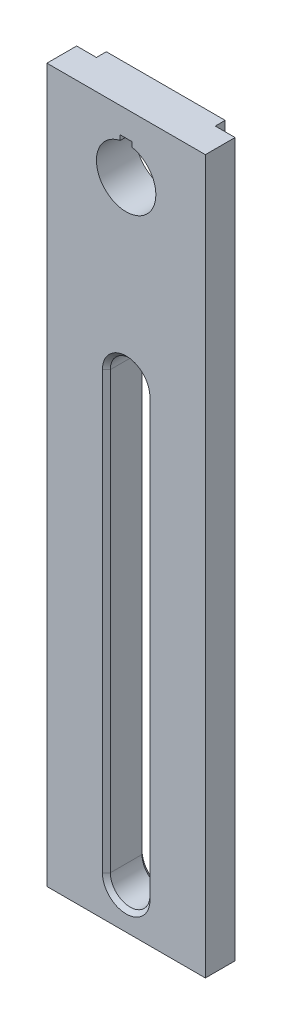
ISO-10303-21;
HEADER;
FILE_DESCRIPTION(('STEP AP214'),'2;1');
FILE_NAME('part.step','',(''),(''),'','','');
FILE_SCHEMA(('AUTOMOTIVE_DESIGN { 1 0 10303 214 1 1 1 1 }'));
ENDSEC;
DATA;
#1=APPLICATION_CONTEXT('core data for automotive mechanical design processes');
#2=APPLICATION_PROTOCOL_DEFINITION('international standard','automotive_design',2000,#1);
#3=PRODUCT_CONTEXT('',#1,'mechanical');
#4=PRODUCT('Part','Part','',(#3));
#5=PRODUCT_RELATED_PRODUCT_CATEGORY('part','',(#4));
#6=PRODUCT_DEFINITION_FORMATION('','',#4);
#7=PRODUCT_DEFINITION_CONTEXT('part definition',#1,'design');
#8=PRODUCT_DEFINITION('design','',#6,#7);
#9=PRODUCT_DEFINITION_SHAPE('','',#8);
#10=(LENGTH_UNIT() NAMED_UNIT(*) SI_UNIT(.MILLI.,.METRE.));
#11=(NAMED_UNIT(*) PLANE_ANGLE_UNIT() SI_UNIT($,.RADIAN.));
#12=(NAMED_UNIT(*) SI_UNIT($,.STERADIAN.) SOLID_ANGLE_UNIT());
#13=UNCERTAINTY_MEASURE_WITH_UNIT(LENGTH_MEASURE(1.E-05),#10,'distance_accuracy_value','');
#14=(GEOMETRIC_REPRESENTATION_CONTEXT(3) GLOBAL_UNCERTAINTY_ASSIGNED_CONTEXT((#13)) GLOBAL_UNIT_ASSIGNED_CONTEXT((#10,
#11,#12)) REPRESENTATION_CONTEXT('',''));
#15=CARTESIAN_POINT('',(0.,0.,0.));
#16=DIRECTION('',(0.,0.,1.));
#17=DIRECTION('',(1.,0.,0.));
#18=AXIS2_PLACEMENT_3D('',#15,#16,#17);
#19=CARTESIAN_POINT('',(0.,0.,10.));
#20=DIRECTION('',(0.,0.,1.));
#21=DIRECTION('',(1.,0.,0.));
#22=AXIS2_PLACEMENT_3D('',#19,#20,#21);
#23=PLANE('',#22);
#24=DIRECTION('',(0.,1.,0.));
#25=VECTOR('',#24,1.);
#26=CARTESIAN_POINT('',(-6.00000000000001,0.,10.));
#27=LINE('',#26,#25);
#28=CARTESIAN_POINT('',(-6.,30.,10.));
#29=VERTEX_POINT('',#28);
#30=CARTESIAN_POINT('',(-5.99999999999999,140.,10.));
#31=VERTEX_POINT('',#30);
#32=EDGE_CURVE('E235',#29,#31,#27,.T.);
#33=ORIENTED_EDGE('',*,*,#32,.T.);
#34=CARTESIAN_POINT('',(0.,140.,10.));
#35=DIRECTION('',(0.,0.,1.));
#36=DIRECTION('',(1.,0.,0.));
#37=AXIS2_PLACEMENT_3D('',#34,#35,#36);
#38=CIRCLE('',#37,5.99999999999997);
#39=CARTESIAN_POINT('',(5.99999999999995,140.,10.));
#40=VERTEX_POINT('',#39);
#41=EDGE_CURVE('E11',#31,#40,#38,.F.);
#42=ORIENTED_EDGE('',*,*,#41,.T.);
#43=DIRECTION('',(0.,-1.,0.));
#44=VECTOR('',#43,1.);
#45=CARTESIAN_POINT('',(6.,0.,10.));
#46=LINE('',#45,#44);
#47=CARTESIAN_POINT('',(5.99999999999999,30.,10.));
#48=VERTEX_POINT('',#47);
#49=EDGE_CURVE('E47',#40,#48,#46,.T.);
#50=ORIENTED_EDGE('',*,*,#49,.T.);
#51=CARTESIAN_POINT('',(0.,30.,10.));
#52=DIRECTION('',(0.,0.,1.));
#53=DIRECTION('',(1.,0.,0.));
#54=AXIS2_PLACEMENT_3D('',#51,#52,#53);
#55=CIRCLE('',#54,6.);
#56=EDGE_CURVE('E237',#48,#29,#55,.F.);
#57=ORIENTED_EDGE('',*,*,#56,.T.);
#58=EDGE_LOOP('',(#33,#42,#50,#57));
#59=FACE_BOUND('',#58,.T.);
#60=CARTESIAN_POINT('',(0.,185.,10.));
#61=DIRECTION('',(0.,0.,1.));
#62=DIRECTION('',(1.,0.,0.));
#63=AXIS2_PLACEMENT_3D('',#60,#61,#62);
#64=CIRCLE('',#63,7.5);
#65=CARTESIAN_POINT('',(-1.49351545528312,192.349789900727,10.));
#66=VERTEX_POINT('',#65);
#67=CARTESIAN_POINT('',(1.49351545528312,192.349789900727,10.));
#68=VERTEX_POINT('',#67);
#69=EDGE_CURVE('E295',#66,#68,#64,.T.);
#70=ORIENTED_EDGE('',*,*,#69,.F.);
#71=DIRECTION('',(0.,-1.,0.));
#72=VECTOR('',#71,1.);
#73=CARTESIAN_POINT('',(-1.49351545528312,193.580554332855,10.));
#74=LINE('',#73,#72);
#75=CARTESIAN_POINT('',(-1.49351545528312,193.580554332855,10.));
#76=VERTEX_POINT('',#75);
#77=EDGE_CURVE('E293',#76,#66,#74,.T.);
#78=ORIENTED_EDGE('',*,*,#77,.F.);
#79=DIRECTION('',(-1.,0.,0.));
#80=VECTOR('',#79,1.);
#81=CARTESIAN_POINT('',(1.49351545528312,193.580554332855,10.));
#82=LINE('',#81,#80);
#83=CARTESIAN_POINT('',(1.49351545528312,193.580554332855,10.));
#84=VERTEX_POINT('',#83);
#85=EDGE_CURVE('E301',#84,#76,#82,.T.);
#86=ORIENTED_EDGE('',*,*,#85,.F.);
#87=DIRECTION('',(0.,1.,0.));
#88=VECTOR('',#87,1.);
#89=CARTESIAN_POINT('',(1.49351545528312,193.580554332855,10.));
#90=LINE('',#89,#88);
#91=EDGE_CURVE('E298',#68,#84,#90,.T.);
#92=ORIENTED_EDGE('',*,*,#91,.F.);
#93=EDGE_LOOP('',(#70,#78,#86,#92));
#94=FACE_BOUND('',#93,.T.);
#95=DIRECTION('',(1.,0.,0.));
#96=VECTOR('',#95,1.);
#97=CARTESIAN_POINT('',(20.,20.,10.));
#98=LINE('',#97,#96);
#99=CARTESIAN_POINT('',(-19.9999999999999,20.,10.));
#100=VERTEX_POINT('',#99);
#101=CARTESIAN_POINT('',(20.,20.,10.));
#102=VERTEX_POINT('',#101);
#103=EDGE_CURVE('E321',#100,#102,#98,.T.);
#104=ORIENTED_EDGE('',*,*,#103,.T.);
#105=DIRECTION('',(0.,1.,0.));
#106=VECTOR('',#105,1.);
#107=CARTESIAN_POINT('',(20.,200.,10.));
#108=LINE('',#107,#106);
#109=CARTESIAN_POINT('',(20.,200.,10.));
#110=VERTEX_POINT('',#109);
#111=EDGE_CURVE('E200',#102,#110,#108,.T.);
#112=ORIENTED_EDGE('',*,*,#111,.T.);
#113=DIRECTION('',(-1.,0.,0.));
#114=VECTOR('',#113,1.);
#115=CARTESIAN_POINT('',(20.,200.,10.));
#116=LINE('',#115,#114);
#117=CARTESIAN_POINT('',(-20.,200.,10.));
#118=VERTEX_POINT('',#117);
#119=EDGE_CURVE('E325',#110,#118,#116,.T.);
#120=ORIENTED_EDGE('',*,*,#119,.T.);
#121=DIRECTION('',(0.,-1.,0.));
#122=VECTOR('',#121,1.);
#123=CARTESIAN_POINT('',(-20.,200.,10.));
#124=LINE('',#123,#122);
#125=EDGE_CURVE('E327',#118,#100,#124,.T.);
#126=ORIENTED_EDGE('',*,*,#125,.T.);
#127=EDGE_LOOP('',(#104,#112,#120,#126));
#128=FACE_BOUND('',#127,.T.);
#129=ADVANCED_FACE('F38',(#59,#94,#128),#23,.T.);
#130=CARTESIAN_POINT('',(0.,0.,0.));
#131=DIRECTION('',(0.,0.,1.));
#132=DIRECTION('',(1.,0.,0.));
#133=AXIS2_PLACEMENT_3D('',#130,#131,#132);
#134=PLANE('',#133);
#135=DIRECTION('',(0.,1.,0.));
#136=VECTOR('',#135,1.);
#137=CARTESIAN_POINT('',(5.99999999999996,140.,0.));
#138=LINE('',#137,#136);
#139=CARTESIAN_POINT('',(6.,30.,0.));
#140=VERTEX_POINT('',#139);
#141=CARTESIAN_POINT('',(5.99999999999996,140.,0.));
#142=VERTEX_POINT('',#141);
#143=EDGE_CURVE('E205',#140,#142,#138,.T.);
#144=ORIENTED_EDGE('',*,*,#143,.T.);
#145=CARTESIAN_POINT('',(0.,140.,0.));
#146=DIRECTION('',(0.,0.,1.));
#147=DIRECTION('',(1.,0.,0.));
#148=AXIS2_PLACEMENT_3D('',#145,#146,#147);
#149=CIRCLE('',#148,5.99999999999998);
#150=CARTESIAN_POINT('',(-6.,140.,0.));
#151=VERTEX_POINT('',#150);
#152=EDGE_CURVE('E214',#142,#151,#149,.T.);
#153=ORIENTED_EDGE('',*,*,#152,.T.);
#154=DIRECTION('',(0.,-1.,0.));
#155=VECTOR('',#154,1.);
#156=CARTESIAN_POINT('',(-6.00000000000001,30.,0.));
#157=LINE('',#156,#155);
#158=CARTESIAN_POINT('',(-6.00000000000001,30.,0.));
#159=VERTEX_POINT('',#158);
#160=EDGE_CURVE('E212',#151,#159,#157,.T.);
#161=ORIENTED_EDGE('',*,*,#160,.T.);
#162=CARTESIAN_POINT('',(0.,30.,0.));
#163=DIRECTION('',(0.,0.,1.));
#164=DIRECTION('',(1.,0.,0.));
#165=AXIS2_PLACEMENT_3D('',#162,#163,#164);
#166=CIRCLE('',#165,6.);
#167=EDGE_CURVE('E202',#159,#140,#166,.T.);
#168=ORIENTED_EDGE('',*,*,#167,.T.);
#169=EDGE_LOOP('',(#144,#153,#161,#168));
#170=FACE_BOUND('',#169,.T.);
#171=DIRECTION('',(0.,-1.,0.));
#172=VECTOR('',#171,1.);
#173=CARTESIAN_POINT('',(-1.49351545528312,193.580554332855,0.));
#174=LINE('',#173,#172);
#175=CARTESIAN_POINT('',(-1.49351545528312,193.580554332855,0.));
#176=VERTEX_POINT('',#175);
#177=CARTESIAN_POINT('',(-1.49351545528312,192.349789900727,0.));
#178=VERTEX_POINT('',#177);
#179=EDGE_CURVE('E283',#176,#178,#174,.T.);
#180=ORIENTED_EDGE('',*,*,#179,.T.);
#181=CARTESIAN_POINT('',(0.,185.,0.));
#182=DIRECTION('',(0.,0.,1.));
#183=DIRECTION('',(1.,0.,0.));
#184=AXIS2_PLACEMENT_3D('',#181,#182,#183);
#185=CIRCLE('',#184,7.5);
#186=CARTESIAN_POINT('',(1.49351545528312,192.349789900727,0.));
#187=VERTEX_POINT('',#186);
#188=EDGE_CURVE('E287',#178,#187,#185,.T.);
#189=ORIENTED_EDGE('',*,*,#188,.T.);
#190=DIRECTION('',(0.,1.,0.));
#191=VECTOR('',#190,1.);
#192=CARTESIAN_POINT('',(1.49351545528312,193.580554332855,0.));
#193=LINE('',#192,#191);
#194=CARTESIAN_POINT('',(1.49351545528312,193.580554332855,0.));
#195=VERTEX_POINT('',#194);
#196=EDGE_CURVE('E306',#187,#195,#193,.T.);
#197=ORIENTED_EDGE('',*,*,#196,.T.);
#198=DIRECTION('',(-1.,0.,0.));
#199=VECTOR('',#198,1.);
#200=CARTESIAN_POINT('',(1.49351545528312,193.580554332855,0.));
#201=LINE('',#200,#199);
#202=EDGE_CURVE('E296',#195,#176,#201,.T.);
#203=ORIENTED_EDGE('',*,*,#202,.T.);
#204=EDGE_LOOP('',(#180,#189,#197,#203));
#205=FACE_BOUND('',#204,.T.);
#206=DIRECTION('',(-1.,0.,0.));
#207=VECTOR('',#206,1.);
#208=CARTESIAN_POINT('',(20.,200.,0.));
#209=LINE('',#208,#207);
#210=CARTESIAN_POINT('',(15.,200.,0.));
#211=VERTEX_POINT('',#210);
#212=CARTESIAN_POINT('',(-15.,200.,0.));
#213=VERTEX_POINT('',#212);
#214=EDGE_CURVE('E323',#211,#213,#209,.T.);
#215=ORIENTED_EDGE('',*,*,#214,.F.);
#216=DIRECTION('',(0.,1.,0.));
#217=VECTOR('',#216,1.);
#218=CARTESIAN_POINT('',(15.,20.,0.));
#219=LINE('',#218,#217);
#220=CARTESIAN_POINT('',(15.,20.,0.));
#221=VERTEX_POINT('',#220);
#222=EDGE_CURVE('E188',#221,#211,#219,.T.);
#223=ORIENTED_EDGE('',*,*,#222,.F.);
#224=DIRECTION('',(1.,0.,0.));
#225=VECTOR('',#224,1.);
#226=CARTESIAN_POINT('',(20.,20.,0.));
#227=LINE('',#226,#225);
#228=CARTESIAN_POINT('',(-15.,20.,0.));
#229=VERTEX_POINT('',#228);
#230=EDGE_CURVE('E320',#229,#221,#227,.T.);
#231=ORIENTED_EDGE('',*,*,#230,.F.);
#232=DIRECTION('',(0.,1.,0.));
#233=VECTOR('',#232,1.);
#234=CARTESIAN_POINT('',(-15.,20.,0.));
#235=LINE('',#234,#233);
#236=EDGE_CURVE('E360',#229,#213,#235,.T.);
#237=ORIENTED_EDGE('',*,*,#236,.T.);
#238=EDGE_LOOP('',(#215,#223,#231,#237));
#239=FACE_BOUND('',#238,.T.);
#240=ADVANCED_FACE('F384',(#170,#205,#239),#134,.F.);
#241=CARTESIAN_POINT('',(20.,20.,10.));
#242=DIRECTION('',(0.,1.,0.));
#243=DIRECTION('',(0.,0.,1.));
#244=AXIS2_PLACEMENT_3D('',#241,#242,#243);
#245=PLANE('',#244);
#246=DIRECTION('',(0.,0.,1.));
#247=VECTOR('',#246,1.);
#248=CARTESIAN_POINT('',(15.,20.,2.5));
#249=LINE('',#248,#247);
#250=CARTESIAN_POINT('',(15.,20.,2.5));
#251=VERTEX_POINT('',#250);
#252=EDGE_CURVE('E189',#221,#251,#249,.T.);
#253=ORIENTED_EDGE('',*,*,#252,.T.);
#254=DIRECTION('',(1.,0.,0.));
#255=VECTOR('',#254,1.);
#256=CARTESIAN_POINT('',(20.,20.,2.5));
#257=LINE('',#256,#255);
#258=CARTESIAN_POINT('',(20.,20.,2.5));
#259=VERTEX_POINT('',#258);
#260=EDGE_CURVE('E180',#251,#259,#257,.T.);
#261=ORIENTED_EDGE('',*,*,#260,.T.);
#262=DIRECTION('',(0.,0.,-1.));
#263=VECTOR('',#262,1.);
#264=CARTESIAN_POINT('',(20.,20.,10.));
#265=LINE('',#264,#263);
#266=EDGE_CURVE('E195',#102,#259,#265,.T.);
#267=ORIENTED_EDGE('',*,*,#266,.F.);
#268=ORIENTED_EDGE('',*,*,#103,.F.);
#269=DIRECTION('',(0.,0.,-1.));
#270=VECTOR('',#269,1.);
#271=CARTESIAN_POINT('',(-19.9999999999999,20.,10.));
#272=LINE('',#271,#270);
#273=CARTESIAN_POINT('',(-19.9999999999999,20.,2.5));
#274=VERTEX_POINT('',#273);
#275=EDGE_CURVE('E329',#100,#274,#272,.T.);
#276=ORIENTED_EDGE('',*,*,#275,.T.);
#277=DIRECTION('',(1.,0.,0.));
#278=VECTOR('',#277,1.);
#279=CARTESIAN_POINT('',(-20.,20.,2.5));
#280=LINE('',#279,#278);
#281=CARTESIAN_POINT('',(-15.,20.,2.5));
#282=VERTEX_POINT('',#281);
#283=EDGE_CURVE('E353',#274,#282,#280,.T.);
#284=ORIENTED_EDGE('',*,*,#283,.T.);
#285=DIRECTION('',(0.,0.,-1.));
#286=VECTOR('',#285,1.);
#287=CARTESIAN_POINT('',(-15.,20.,2.5));
#288=LINE('',#287,#286);
#289=EDGE_CURVE('E357',#282,#229,#288,.T.);
#290=ORIENTED_EDGE('',*,*,#289,.T.);
#291=ORIENTED_EDGE('',*,*,#230,.T.);
#292=EDGE_LOOP('',(#253,#261,#267,#268,#276,#284,#290,#291));
#293=FACE_BOUND('',#292,.T.);
#294=ADVANCED_FACE('F193',(#293),#245,.F.);
#295=CARTESIAN_POINT('',(20.,200.,10.));
#296=DIRECTION('',(-1.,0.,0.));
#297=DIRECTION('',(0.,-1.,0.));
#298=AXIS2_PLACEMENT_3D('',#295,#296,#297);
#299=PLANE('',#298);
#300=ORIENTED_EDGE('',*,*,#266,.T.);
#301=DIRECTION('',(0.,1.,0.));
#302=VECTOR('',#301,1.);
#303=CARTESIAN_POINT('',(20.,20.,2.5));
#304=LINE('',#303,#302);
#305=CARTESIAN_POINT('',(20.,200.,2.5));
#306=VERTEX_POINT('',#305);
#307=EDGE_CURVE('E177',#259,#306,#304,.T.);
#308=ORIENTED_EDGE('',*,*,#307,.T.);
#309=DIRECTION('',(0.,0.,-1.));
#310=VECTOR('',#309,1.);
#311=CARTESIAN_POINT('',(20.,200.,10.));
#312=LINE('',#311,#310);
#313=EDGE_CURVE('E203',#110,#306,#312,.T.);
#314=ORIENTED_EDGE('',*,*,#313,.F.);
#315=ORIENTED_EDGE('',*,*,#111,.F.);
#316=EDGE_LOOP('',(#300,#308,#314,#315));
#317=FACE_BOUND('',#316,.T.);
#318=ADVANCED_FACE('F199',(#317),#299,.F.);
#319=CARTESIAN_POINT('',(20.,200.,10.));
#320=DIRECTION('',(0.,-1.,0.));
#321=DIRECTION('',(0.,0.,-1.));
#322=AXIS2_PLACEMENT_3D('',#319,#320,#321);
#323=PLANE('',#322);
#324=ORIENTED_EDGE('',*,*,#313,.T.);
#325=DIRECTION('',(1.,0.,0.));
#326=VECTOR('',#325,1.);
#327=CARTESIAN_POINT('',(20.,200.,2.5));
#328=LINE('',#327,#326);
#329=CARTESIAN_POINT('',(15.,200.,2.5));
#330=VERTEX_POINT('',#329);
#331=EDGE_CURVE('E183',#330,#306,#328,.T.);
#332=ORIENTED_EDGE('',*,*,#331,.F.);
#333=DIRECTION('',(0.,0.,1.));
#334=VECTOR('',#333,1.);
#335=CARTESIAN_POINT('',(15.,200.,2.5));
#336=LINE('',#335,#334);
#337=EDGE_CURVE('E197',#211,#330,#336,.T.);
#338=ORIENTED_EDGE('',*,*,#337,.F.);
#339=ORIENTED_EDGE('',*,*,#214,.T.);
#340=DIRECTION('',(0.,0.,-1.));
#341=VECTOR('',#340,1.);
#342=CARTESIAN_POINT('',(-15.,200.,2.5));
#343=LINE('',#342,#341);
#344=CARTESIAN_POINT('',(-15.,200.,2.5));
#345=VERTEX_POINT('',#344);
#346=EDGE_CURVE('E349',#345,#213,#343,.T.);
#347=ORIENTED_EDGE('',*,*,#346,.F.);
#348=DIRECTION('',(1.,0.,0.));
#349=VECTOR('',#348,1.);
#350=CARTESIAN_POINT('',(-20.,200.,2.5));
#351=LINE('',#350,#349);
#352=CARTESIAN_POINT('',(-20.,200.,2.5));
#353=VERTEX_POINT('',#352);
#354=EDGE_CURVE('E347',#353,#345,#351,.T.);
#355=ORIENTED_EDGE('',*,*,#354,.F.);
#356=DIRECTION('',(0.,0.,-1.));
#357=VECTOR('',#356,1.);
#358=CARTESIAN_POINT('',(-20.,200.,10.));
#359=LINE('',#358,#357);
#360=EDGE_CURVE('E207',#118,#353,#359,.T.);
#361=ORIENTED_EDGE('',*,*,#360,.F.);
#362=ORIENTED_EDGE('',*,*,#119,.F.);
#363=EDGE_LOOP('',(#324,#332,#338,#339,#347,#355,#361,#362));
#364=FACE_BOUND('',#363,.T.);
#365=ADVANCED_FACE('F344',(#364),#323,.F.);
#366=CARTESIAN_POINT('',(-20.,200.,10.));
#367=DIRECTION('',(1.,0.,0.));
#368=DIRECTION('',(0.,1.,0.));
#369=AXIS2_PLACEMENT_3D('',#366,#367,#368);
#370=PLANE('',#369);
#371=ORIENTED_EDGE('',*,*,#360,.T.);
#372=DIRECTION('',(0.,1.,0.));
#373=VECTOR('',#372,1.);
#374=CARTESIAN_POINT('',(-20.,20.,2.5));
#375=LINE('',#374,#373);
#376=EDGE_CURVE('E340',#274,#353,#375,.T.);
#377=ORIENTED_EDGE('',*,*,#376,.F.);
#378=ORIENTED_EDGE('',*,*,#275,.F.);
#379=ORIENTED_EDGE('',*,*,#125,.F.);
#380=EDGE_LOOP('',(#371,#377,#378,#379));
#381=FACE_BOUND('',#380,.T.);
#382=ADVANCED_FACE('F338',(#381),#370,.F.);
#383=CARTESIAN_POINT('',(-1.49351545528312,193.580554332855,10.));
#384=DIRECTION('',(1.,0.,0.));
#385=DIRECTION('',(0.,1.,0.));
#386=AXIS2_PLACEMENT_3D('',#383,#384,#385);
#387=PLANE('',#386);
#388=ORIENTED_EDGE('',*,*,#179,.F.);
#389=DIRECTION('',(0.,0.,-1.));
#390=VECTOR('',#389,1.);
#391=CARTESIAN_POINT('',(-1.49351545528312,193.580554332855,10.));
#392=LINE('',#391,#390);
#393=EDGE_CURVE('E302',#76,#176,#392,.T.);
#394=ORIENTED_EDGE('',*,*,#393,.F.);
#395=ORIENTED_EDGE('',*,*,#77,.T.);
#396=DIRECTION('',(0.,0.,-1.));
#397=VECTOR('',#396,1.);
#398=CARTESIAN_POINT('',(-1.49351545528312,192.349789900727,10.));
#399=LINE('',#398,#397);
#400=EDGE_CURVE('E317',#66,#178,#399,.T.);
#401=ORIENTED_EDGE('',*,*,#400,.T.);
#402=EDGE_LOOP('',(#388,#394,#395,#401));
#403=FACE_BOUND('',#402,.T.);
#404=ADVANCED_FACE('F412',(#403),#387,.T.);
#405=CARTESIAN_POINT('',(0.,185.,10.));
#406=DIRECTION('',(0.,0.,-1.));
#407=DIRECTION('',(-1.,0.,0.));
#408=AXIS2_PLACEMENT_3D('',#405,#406,#407);
#409=CYLINDRICAL_SURFACE('',#408,7.5);
#410=ORIENTED_EDGE('',*,*,#188,.F.);
#411=ORIENTED_EDGE('',*,*,#400,.F.);
#412=ORIENTED_EDGE('',*,*,#69,.T.);
#413=DIRECTION('',(0.,0.,-1.));
#414=VECTOR('',#413,1.);
#415=CARTESIAN_POINT('',(1.49351545528312,192.349789900727,10.));
#416=LINE('',#415,#414);
#417=EDGE_CURVE('E315',#68,#187,#416,.T.);
#418=ORIENTED_EDGE('',*,*,#417,.T.);
#419=EDGE_LOOP('',(#410,#411,#412,#418));
#420=FACE_BOUND('',#419,.T.);
#421=ADVANCED_FACE('F529',(#420),#409,.F.);
#422=CARTESIAN_POINT('',(1.49351545528312,193.580554332855,10.));
#423=DIRECTION('',(-1.,0.,0.));
#424=DIRECTION('',(0.,-1.,0.));
#425=AXIS2_PLACEMENT_3D('',#422,#423,#424);
#426=PLANE('',#425);
#427=ORIENTED_EDGE('',*,*,#196,.F.);
#428=ORIENTED_EDGE('',*,*,#417,.F.);
#429=ORIENTED_EDGE('',*,*,#91,.T.);
#430=DIRECTION('',(0.,0.,-1.));
#431=VECTOR('',#430,1.);
#432=CARTESIAN_POINT('',(1.49351545528312,193.580554332855,10.));
#433=LINE('',#432,#431);
#434=EDGE_CURVE('E313',#84,#195,#433,.T.);
#435=ORIENTED_EDGE('',*,*,#434,.T.);
#436=EDGE_LOOP('',(#427,#428,#429,#435));
#437=FACE_BOUND('',#436,.T.);
#438=ADVANCED_FACE('F517',(#437),#426,.T.);
#439=CARTESIAN_POINT('',(1.49351545528312,193.580554332855,10.));
#440=DIRECTION('',(0.,-1.,0.));
#441=DIRECTION('',(0.,0.,-1.));
#442=AXIS2_PLACEMENT_3D('',#439,#440,#441);
#443=PLANE('',#442);
#444=ORIENTED_EDGE('',*,*,#202,.F.);
#445=ORIENTED_EDGE('',*,*,#434,.F.);
#446=ORIENTED_EDGE('',*,*,#85,.T.);
#447=ORIENTED_EDGE('',*,*,#393,.T.);
#448=EDGE_LOOP('',(#444,#445,#446,#447));
#449=FACE_BOUND('',#448,.T.);
#450=ADVANCED_FACE('F512',(#449),#443,.T.);
#451=CARTESIAN_POINT('',(0.,140.,10.));
#452=DIRECTION('',(0.,0.,-1.));
#453=DIRECTION('',(-1.,0.,0.));
#454=AXIS2_PLACEMENT_3D('',#451,#452,#453);
#455=CYLINDRICAL_SURFACE('',#454,5.);
#456=DIRECTION('',(0.,0.,-1.));
#457=VECTOR('',#456,1.);
#458=CARTESIAN_POINT('',(-5.00000000000002,140.,10.));
#459=LINE('',#458,#457);
#460=CARTESIAN_POINT('',(-5.00000000000002,140.,9.00000000000003));
#461=VERTEX_POINT('',#460);
#462=CARTESIAN_POINT('',(-5.00000000000002,140.,1.00000000000002));
#463=VERTEX_POINT('',#462);
#464=EDGE_CURVE('E277',#461,#463,#459,.T.);
#465=ORIENTED_EDGE('',*,*,#464,.T.);
#466=CARTESIAN_POINT('',(0.,140.,1.00000000000002));
#467=DIRECTION('',(0.,0.,1.));
#468=DIRECTION('',(1.,0.,0.));
#469=AXIS2_PLACEMENT_3D('',#466,#467,#468);
#470=CIRCLE('',#469,5.);
#471=CARTESIAN_POINT('',(4.99999999999998,140.,1.00000000000002));
#472=VERTEX_POINT('',#471);
#473=EDGE_CURVE('E220',#463,#472,#470,.F.);
#474=ORIENTED_EDGE('',*,*,#473,.T.);
#475=DIRECTION('',(0.,0.,-1.));
#476=VECTOR('',#475,1.);
#477=CARTESIAN_POINT('',(4.99999999999998,140.,10.));
#478=LINE('',#477,#476);
#479=CARTESIAN_POINT('',(4.99999999999998,140.,9.00000000000003));
#480=VERTEX_POINT('',#479);
#481=EDGE_CURVE('E280',#480,#472,#478,.T.);
#482=ORIENTED_EDGE('',*,*,#481,.F.);
#483=CARTESIAN_POINT('',(0.,140.,9.00000000000003));
#484=DIRECTION('',(0.,0.,1.));
#485=DIRECTION('',(1.,0.,0.));
#486=AXIS2_PLACEMENT_3D('',#483,#484,#485);
#487=CIRCLE('',#486,5.);
#488=EDGE_CURVE('E217',#480,#461,#487,.T.);
#489=ORIENTED_EDGE('',*,*,#488,.T.);
#490=EDGE_LOOP('',(#465,#474,#482,#489));
#491=FACE_BOUND('',#490,.T.);
#492=ADVANCED_FACE('F276',(#491),#455,.F.);
#493=CARTESIAN_POINT('',(-5.00000000000002,140.,10.));
#494=DIRECTION('',(1.,0.,0.));
#495=DIRECTION('',(0.,1.,0.));
#496=AXIS2_PLACEMENT_3D('',#493,#494,#495);
#497=PLANE('',#496);
#498=DIRECTION('',(0.,0.,-1.));
#499=VECTOR('',#498,1.);
#500=CARTESIAN_POINT('',(-5.00000000000003,30.,10.));
#501=LINE('',#500,#499);
#502=CARTESIAN_POINT('',(-5.00000000000003,30.,9.00000000000003));
#503=VERTEX_POINT('',#502);
#504=CARTESIAN_POINT('',(-5.00000000000003,30.,1.00000000000002));
#505=VERTEX_POINT('',#504);
#506=EDGE_CURVE('E284',#503,#505,#501,.T.);
#507=ORIENTED_EDGE('',*,*,#506,.T.);
#508=DIRECTION('',(0.,1.,0.));
#509=VECTOR('',#508,1.);
#510=CARTESIAN_POINT('',(-5.00000000000002,140.,1.00000000000002));
#511=LINE('',#510,#509);
#512=EDGE_CURVE('E225',#505,#463,#511,.T.);
#513=ORIENTED_EDGE('',*,*,#512,.T.);
#514=ORIENTED_EDGE('',*,*,#464,.F.);
#515=DIRECTION('',(0.,-1.,0.));
#516=VECTOR('',#515,1.);
#517=CARTESIAN_POINT('',(-5.00000000000002,140.,9.00000000000003));
#518=LINE('',#517,#516);
#519=EDGE_CURVE('E223',#461,#503,#518,.T.);
#520=ORIENTED_EDGE('',*,*,#519,.T.);
#521=EDGE_LOOP('',(#507,#513,#514,#520));
#522=FACE_BOUND('',#521,.T.);
#523=ADVANCED_FACE('F281',(#522),#497,.T.);
#524=CARTESIAN_POINT('',(0.,30.,10.));
#525=DIRECTION('',(0.,0.,-1.));
#526=DIRECTION('',(-1.,0.,0.));
#527=AXIS2_PLACEMENT_3D('',#524,#525,#526);
#528=CYLINDRICAL_SURFACE('',#527,5.00000000000002);
#529=DIRECTION('',(0.,0.,-1.));
#530=VECTOR('',#529,1.);
#531=CARTESIAN_POINT('',(5.00000000000002,30.,10.));
#532=LINE('',#531,#530);
#533=CARTESIAN_POINT('',(5.00000000000002,30.,9.00000000000003));
#534=VERTEX_POINT('',#533);
#535=CARTESIAN_POINT('',(5.00000000000002,30.,1.00000000000002));
#536=VERTEX_POINT('',#535);
#537=EDGE_CURVE('E289',#534,#536,#532,.T.);
#538=ORIENTED_EDGE('',*,*,#537,.T.);
#539=CARTESIAN_POINT('',(0.,30.,1.00000000000002));
#540=DIRECTION('',(0.,0.,1.));
#541=DIRECTION('',(1.,0.,0.));
#542=AXIS2_PLACEMENT_3D('',#539,#540,#541);
#543=CIRCLE('',#542,5.00000000000002);
#544=EDGE_CURVE('E233',#536,#505,#543,.F.);
#545=ORIENTED_EDGE('',*,*,#544,.T.);
#546=ORIENTED_EDGE('',*,*,#506,.F.);
#547=CARTESIAN_POINT('',(0.,30.,9.00000000000003));
#548=DIRECTION('',(0.,0.,1.));
#549=DIRECTION('',(1.,0.,0.));
#550=AXIS2_PLACEMENT_3D('',#547,#548,#549);
#551=CIRCLE('',#550,5.00000000000002);
#552=EDGE_CURVE('E231',#503,#534,#551,.T.);
#553=ORIENTED_EDGE('',*,*,#552,.T.);
#554=EDGE_LOOP('',(#538,#545,#546,#553));
#555=FACE_BOUND('',#554,.T.);
#556=ADVANCED_FACE('F370',(#555),#528,.F.);
#557=CARTESIAN_POINT('',(4.99999999999998,140.,10.));
#558=DIRECTION('',(-1.,0.,0.));
#559=DIRECTION('',(0.,-1.,0.));
#560=AXIS2_PLACEMENT_3D('',#557,#558,#559);
#561=PLANE('',#560);
#562=ORIENTED_EDGE('',*,*,#481,.T.);
#563=DIRECTION('',(0.,-1.,0.));
#564=VECTOR('',#563,1.);
#565=CARTESIAN_POINT('',(5.00000000000002,30.,1.00000000000002));
#566=LINE('',#565,#564);
#567=EDGE_CURVE('E229',#472,#536,#566,.T.);
#568=ORIENTED_EDGE('',*,*,#567,.T.);
#569=ORIENTED_EDGE('',*,*,#537,.F.);
#570=DIRECTION('',(0.,1.,0.));
#571=VECTOR('',#570,1.);
#572=CARTESIAN_POINT('',(4.99999999999998,140.,9.00000000000003));
#573=LINE('',#572,#571);
#574=EDGE_CURVE('E227',#534,#480,#573,.T.);
#575=ORIENTED_EDGE('',*,*,#574,.T.);
#576=EDGE_LOOP('',(#562,#568,#569,#575));
#577=FACE_BOUND('',#576,.T.);
#578=ADVANCED_FACE('F392',(#577),#561,.T.);
#579=CARTESIAN_POINT('',(-15.,20.,2.5));
#580=DIRECTION('',(1.,0.,0.));
#581=DIRECTION('',(0.,0.,-1.));
#582=AXIS2_PLACEMENT_3D('',#579,#580,#581);
#583=PLANE('',#582);
#584=ORIENTED_EDGE('',*,*,#346,.T.);
#585=ORIENTED_EDGE('',*,*,#236,.F.);
#586=ORIENTED_EDGE('',*,*,#289,.F.);
#587=DIRECTION('',(0.,1.,0.));
#588=VECTOR('',#587,1.);
#589=CARTESIAN_POINT('',(-15.,20.,2.5));
#590=LINE('',#589,#588);
#591=EDGE_CURVE('E363',#282,#345,#590,.T.);
#592=ORIENTED_EDGE('',*,*,#591,.T.);
#593=EDGE_LOOP('',(#584,#585,#586,#592));
#594=FACE_BOUND('',#593,.T.);
#595=ADVANCED_FACE('F394',(#594),#583,.F.);
#596=CARTESIAN_POINT('',(-20.,20.,2.5));
#597=DIRECTION('',(0.,0.,1.));
#598=DIRECTION('',(1.,0.,0.));
#599=AXIS2_PLACEMENT_3D('',#596,#597,#598);
#600=PLANE('',#599);
#601=ORIENTED_EDGE('',*,*,#354,.T.);
#602=ORIENTED_EDGE('',*,*,#591,.F.);
#603=ORIENTED_EDGE('',*,*,#283,.F.);
#604=ORIENTED_EDGE('',*,*,#376,.T.);
#605=EDGE_LOOP('',(#601,#602,#603,#604));
#606=FACE_BOUND('',#605,.T.);
#607=ADVANCED_FACE('F400',(#606),#600,.F.);
#608=CARTESIAN_POINT('',(20.,20.,2.5));
#609=DIRECTION('',(0.,0.,1.));
#610=DIRECTION('',(1.,0.,0.));
#611=AXIS2_PLACEMENT_3D('',#608,#609,#610);
#612=PLANE('',#611);
#613=ORIENTED_EDGE('',*,*,#331,.T.);
#614=ORIENTED_EDGE('',*,*,#307,.F.);
#615=ORIENTED_EDGE('',*,*,#260,.F.);
#616=DIRECTION('',(0.,1.,0.));
#617=VECTOR('',#616,1.);
#618=CARTESIAN_POINT('',(15.,20.,2.5));
#619=LINE('',#618,#617);
#620=EDGE_CURVE('E351',#251,#330,#619,.T.);
#621=ORIENTED_EDGE('',*,*,#620,.T.);
#622=EDGE_LOOP('',(#613,#614,#615,#621));
#623=FACE_BOUND('',#622,.T.);
#624=ADVANCED_FACE('F179',(#623),#612,.F.);
#625=CARTESIAN_POINT('',(15.,20.,2.5));
#626=DIRECTION('',(-1.,0.,0.));
#627=DIRECTION('',(0.,0.,1.));
#628=AXIS2_PLACEMENT_3D('',#625,#626,#627);
#629=PLANE('',#628);
#630=ORIENTED_EDGE('',*,*,#337,.T.);
#631=ORIENTED_EDGE('',*,*,#620,.F.);
#632=ORIENTED_EDGE('',*,*,#252,.F.);
#633=ORIENTED_EDGE('',*,*,#222,.T.);
#634=EDGE_LOOP('',(#630,#631,#632,#633));
#635=FACE_BOUND('',#634,.T.);
#636=ADVANCED_FACE('F431',(#635),#629,.F.);
#637=CARTESIAN_POINT('',(0.,30.,0.));
#638=DIRECTION('',(0.,0.,-1.));
#639=DIRECTION('',(-1.,0.,0.));
#640=AXIS2_PLACEMENT_3D('',#637,#638,#639);
#641=CONICAL_SURFACE('',#640,6.,0.785398163397428);
#642=DIRECTION('',(-0.707106781186533,0.,-0.707106781186562));
#643=VECTOR('',#642,1.);
#644=CARTESIAN_POINT('',(-5.00000000000003,30.,1.00000000000002));
#645=LINE('',#644,#643);
#646=EDGE_CURVE('E244',#505,#159,#645,.T.);
#647=ORIENTED_EDGE('',*,*,#646,.F.);
#648=ORIENTED_EDGE('',*,*,#544,.F.);
#649=DIRECTION('',(-0.707106781186533,0.,0.707106781186562));
#650=VECTOR('',#649,1.);
#651=CARTESIAN_POINT('',(6.,30.,0.));
#652=LINE('',#651,#650);
#653=EDGE_CURVE('E247',#140,#536,#652,.T.);
#654=ORIENTED_EDGE('',*,*,#653,.F.);
#655=ORIENTED_EDGE('',*,*,#167,.F.);
#656=EDGE_LOOP('',(#647,#648,#654,#655));
#657=FACE_BOUND('',#656,.T.);
#658=ADVANCED_FACE('F375',(#657),#641,.F.);
#659=CARTESIAN_POINT('',(6.00000000000001,0.,0.));
#660=DIRECTION('',(-0.707106781186561,0.,-0.707106781186534));
#661=DIRECTION('',(0.,-1.,0.));
#662=AXIS2_PLACEMENT_3D('',#659,#660,#661);
#663=PLANE('',#662);
#664=ORIENTED_EDGE('',*,*,#653,.T.);
#665=ORIENTED_EDGE('',*,*,#567,.F.);
#666=DIRECTION('',(-0.707106781186533,0.,0.707106781186562));
#667=VECTOR('',#666,1.);
#668=CARTESIAN_POINT('',(5.99999999999996,140.,0.));
#669=LINE('',#668,#667);
#670=EDGE_CURVE('E242',#142,#472,#669,.T.);
#671=ORIENTED_EDGE('',*,*,#670,.F.);
#672=ORIENTED_EDGE('',*,*,#143,.F.);
#673=EDGE_LOOP('',(#664,#665,#671,#672));
#674=FACE_BOUND('',#673,.T.);
#675=ADVANCED_FACE('F380',(#674),#663,.T.);
#676=CARTESIAN_POINT('',(-6.00000000000001,0.,0.));
#677=DIRECTION('',(0.707106781186562,0.,-0.707106781186533));
#678=DIRECTION('',(0.,1.,0.));
#679=AXIS2_PLACEMENT_3D('',#676,#677,#678);
#680=PLANE('',#679);
#681=ORIENTED_EDGE('',*,*,#646,.T.);
#682=ORIENTED_EDGE('',*,*,#160,.F.);
#683=DIRECTION('',(-0.707106781186533,0.,-0.707106781186562));
#684=VECTOR('',#683,1.);
#685=CARTESIAN_POINT('',(-5.00000000000002,140.,1.00000000000002));
#686=LINE('',#685,#684);
#687=EDGE_CURVE('E240',#463,#151,#686,.T.);
#688=ORIENTED_EDGE('',*,*,#687,.F.);
#689=ORIENTED_EDGE('',*,*,#512,.F.);
#690=EDGE_LOOP('',(#681,#682,#688,#689));
#691=FACE_BOUND('',#690,.T.);
#692=ADVANCED_FACE('F388',(#691),#680,.T.);
#693=CARTESIAN_POINT('',(0.,140.,0.));
#694=DIRECTION('',(0.,0.,-1.));
#695=DIRECTION('',(-1.,0.,0.));
#696=AXIS2_PLACEMENT_3D('',#693,#694,#695);
#697=CONICAL_SURFACE('',#696,5.99999999999998,0.785398163397428);
#698=ORIENTED_EDGE('',*,*,#670,.T.);
#699=ORIENTED_EDGE('',*,*,#473,.F.);
#700=ORIENTED_EDGE('',*,*,#687,.T.);
#701=ORIENTED_EDGE('',*,*,#152,.F.);
#702=EDGE_LOOP('',(#698,#699,#700,#701));
#703=FACE_BOUND('',#702,.T.);
#704=ADVANCED_FACE('F391',(#703),#697,.F.);
#705=CARTESIAN_POINT('',(0.,30.,9.00000000000003));
#706=DIRECTION('',(0.,0.,1.));
#707=DIRECTION('',(1.,0.,0.));
#708=AXIS2_PLACEMENT_3D('',#705,#706,#707);
#709=CONICAL_SURFACE('',#708,5.00000000000002,0.785398163397448);
#710=DIRECTION('',(0.707106781186548,0.,-0.707106781186548));
#711=VECTOR('',#710,1.);
#712=CARTESIAN_POINT('',(-6.,30.,10.));
#713=LINE('',#712,#711);
#714=EDGE_CURVE('E252',#29,#503,#713,.T.);
#715=ORIENTED_EDGE('',*,*,#714,.F.);
#716=ORIENTED_EDGE('',*,*,#56,.F.);
#717=DIRECTION('',(0.707106781186548,0.,0.707106781186548));
#718=VECTOR('',#717,1.);
#719=CARTESIAN_POINT('',(5.00000000000002,30.,9.00000000000003));
#720=LINE('',#719,#718);
#721=EDGE_CURVE('E42',#534,#48,#720,.T.);
#722=ORIENTED_EDGE('',*,*,#721,.F.);
#723=ORIENTED_EDGE('',*,*,#552,.F.);
#724=EDGE_LOOP('',(#715,#716,#722,#723));
#725=FACE_BOUND('',#724,.T.);
#726=ADVANCED_FACE('F40',(#725),#709,.F.);
#727=CARTESIAN_POINT('',(4.99999999999998,140.,9.00000000000003));
#728=DIRECTION('',(0.707106781186547,0.,-0.707106781186548));
#729=DIRECTION('',(0.,1.,0.));
#730=AXIS2_PLACEMENT_3D('',#727,#728,#729);
#731=PLANE('',#730);
#732=ORIENTED_EDGE('',*,*,#721,.T.);
#733=ORIENTED_EDGE('',*,*,#49,.F.);
#734=DIRECTION('',(0.707106781186548,0.,0.707106781186548));
#735=VECTOR('',#734,1.);
#736=CARTESIAN_POINT('',(4.99999999999998,140.,9.00000000000003));
#737=LINE('',#736,#735);
#738=EDGE_CURVE('E55',#480,#40,#737,.T.);
#739=ORIENTED_EDGE('',*,*,#738,.F.);
#740=ORIENTED_EDGE('',*,*,#574,.F.);
#741=EDGE_LOOP('',(#732,#733,#739,#740));
#742=FACE_BOUND('',#741,.T.);
#743=ADVANCED_FACE('F262',(#742),#731,.F.);
#744=CARTESIAN_POINT('',(-5.00000000000002,140.,9.00000000000003));
#745=DIRECTION('',(-0.707106781186548,0.,-0.707106781186548));
#746=DIRECTION('',(0.,-1.,0.));
#747=AXIS2_PLACEMENT_3D('',#744,#745,#746);
#748=PLANE('',#747);
#749=ORIENTED_EDGE('',*,*,#714,.T.);
#750=ORIENTED_EDGE('',*,*,#519,.F.);
#751=DIRECTION('',(0.707106781186548,0.,-0.707106781186548));
#752=VECTOR('',#751,1.);
#753=CARTESIAN_POINT('',(-5.99999999999999,140.,10.));
#754=LINE('',#753,#752);
#755=EDGE_CURVE('E250',#31,#461,#754,.T.);
#756=ORIENTED_EDGE('',*,*,#755,.F.);
#757=ORIENTED_EDGE('',*,*,#32,.F.);
#758=EDGE_LOOP('',(#749,#750,#756,#757));
#759=FACE_BOUND('',#758,.T.);
#760=ADVANCED_FACE('F268',(#759),#748,.F.);
#761=CARTESIAN_POINT('',(0.,140.,9.00000000000003));
#762=DIRECTION('',(0.,0.,1.));
#763=DIRECTION('',(1.,0.,0.));
#764=AXIS2_PLACEMENT_3D('',#761,#762,#763);
#765=CONICAL_SURFACE('',#764,5.,0.785398163397448);
#766=ORIENTED_EDGE('',*,*,#738,.T.);
#767=ORIENTED_EDGE('',*,*,#41,.F.);
#768=ORIENTED_EDGE('',*,*,#755,.T.);
#769=ORIENTED_EDGE('',*,*,#488,.F.);
#770=EDGE_LOOP('',(#766,#767,#768,#769));
#771=FACE_BOUND('',#770,.T.);
#772=ADVANCED_FACE('F267',(#771),#765,.F.);
#773=CLOSED_SHELL('',(#129,#240,#294,#318,#365,#382,#404,#421,#438,#450,#492,#523,#556,#578,
#595,#607,#624,#636,#658,#675,#692,#704,#726,#743,#760,#772));
#774=MANIFOLD_SOLID_BREP('B2',#773);
#775=ADVANCED_BREP_SHAPE_REPRESENTATION('',(#18,#774),#14);
#776=SHAPE_DEFINITION_REPRESENTATION(#9,#775);
ENDSEC;
END-ISO-10303-21;
